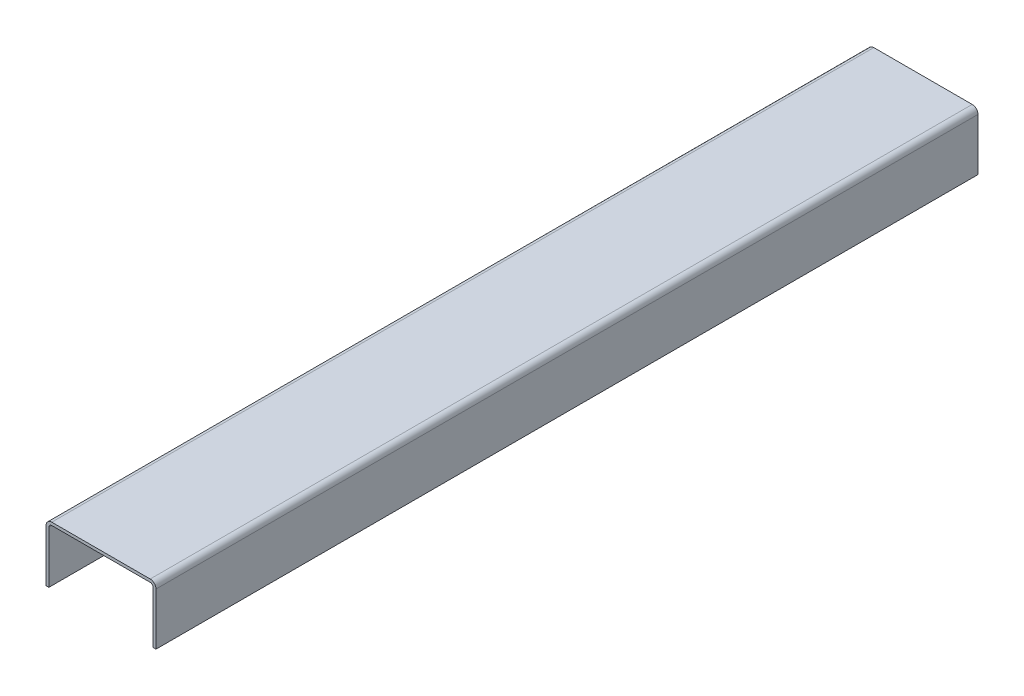
ISO-10303-21;
HEADER;
FILE_DESCRIPTION(('STEP AP214'),'2;1');
FILE_NAME('part.step','',(''),(''),'','','');
FILE_SCHEMA(('AUTOMOTIVE_DESIGN { 1 0 10303 214 1 1 1 1 }'));
ENDSEC;
DATA;
#1=APPLICATION_CONTEXT('core data for automotive mechanical design processes');
#2=APPLICATION_PROTOCOL_DEFINITION('international standard','automotive_design',2000,#1);
#3=PRODUCT_CONTEXT('',#1,'mechanical');
#4=PRODUCT('Part','Part','',(#3));
#5=PRODUCT_RELATED_PRODUCT_CATEGORY('part','',(#4));
#6=PRODUCT_DEFINITION_FORMATION('','',#4);
#7=PRODUCT_DEFINITION_CONTEXT('part definition',#1,'design');
#8=PRODUCT_DEFINITION('design','',#6,#7);
#9=PRODUCT_DEFINITION_SHAPE('','',#8);
#10=(LENGTH_UNIT() NAMED_UNIT(*) SI_UNIT(.MILLI.,.METRE.));
#11=(NAMED_UNIT(*) PLANE_ANGLE_UNIT() SI_UNIT($,.RADIAN.));
#12=(NAMED_UNIT(*) SI_UNIT($,.STERADIAN.) SOLID_ANGLE_UNIT());
#13=UNCERTAINTY_MEASURE_WITH_UNIT(LENGTH_MEASURE(1.E-05),#10,'distance_accuracy_value','');
#14=(GEOMETRIC_REPRESENTATION_CONTEXT(3) GLOBAL_UNCERTAINTY_ASSIGNED_CONTEXT((#13)) GLOBAL_UNIT_ASSIGNED_CONTEXT((#10,
#11,#12)) REPRESENTATION_CONTEXT('',''));
#15=CARTESIAN_POINT('',(0.,0.,0.));
#16=DIRECTION('',(0.,0.,1.));
#17=DIRECTION('',(1.,0.,0.));
#18=AXIS2_PLACEMENT_3D('',#15,#16,#17);
#19=CARTESIAN_POINT('',(0.,0.,284.));
#20=DIRECTION('',(0.,1.,0.));
#21=DIRECTION('',(0.,0.,1.));
#22=AXIS2_PLACEMENT_3D('',#19,#20,#21);
#23=PLANE('',#22);
#24=DIRECTION('',(1.,0.,0.));
#25=VECTOR('',#24,1.);
#26=CARTESIAN_POINT('',(0.,0.,0.));
#27=LINE('',#26,#25);
#28=CARTESIAN_POINT('',(0.,0.,0.));
#29=VERTEX_POINT('',#28);
#30=CARTESIAN_POINT('',(1.,0.,0.));
#31=VERTEX_POINT('',#30);
#32=EDGE_CURVE('E154',#29,#31,#27,.T.);
#33=ORIENTED_EDGE('',*,*,#32,.T.);
#34=DIRECTION('',(0.,0.,-1.));
#35=VECTOR('',#34,1.);
#36=CARTESIAN_POINT('',(1.,0.,284.));
#37=LINE('',#36,#35);
#38=CARTESIAN_POINT('',(1.,0.,284.));
#39=VERTEX_POINT('',#38);
#40=EDGE_CURVE('E11',#39,#31,#37,.T.);
#41=ORIENTED_EDGE('',*,*,#40,.F.);
#42=DIRECTION('',(1.,0.,0.));
#43=VECTOR('',#42,1.);
#44=CARTESIAN_POINT('',(0.,0.,284.));
#45=LINE('',#44,#43);
#46=CARTESIAN_POINT('',(0.,0.,284.));
#47=VERTEX_POINT('',#46);
#48=EDGE_CURVE('E176',#47,#39,#45,.T.);
#49=ORIENTED_EDGE('',*,*,#48,.F.);
#50=DIRECTION('',(0.,0.,-1.));
#51=VECTOR('',#50,1.);
#52=CARTESIAN_POINT('',(0.,0.,284.));
#53=LINE('',#52,#51);
#54=EDGE_CURVE('E150',#47,#29,#53,.T.);
#55=ORIENTED_EDGE('',*,*,#54,.T.);
#56=EDGE_LOOP('',(#33,#41,#49,#55));
#57=FACE_BOUND('',#56,.T.);
#58=ADVANCED_FACE('F34',(#57),#23,.F.);
#59=CARTESIAN_POINT('',(1.,0.,284.));
#60=DIRECTION('',(-1.,0.,0.));
#61=DIRECTION('',(0.,0.,1.));
#62=AXIS2_PLACEMENT_3D('',#59,#60,#61);
#63=PLANE('',#62);
#64=DIRECTION('',(0.,1.,0.));
#65=VECTOR('',#64,1.);
#66=CARTESIAN_POINT('',(1.,0.,0.));
#67=LINE('',#66,#65);
#68=CARTESIAN_POINT('',(1.,18.,0.));
#69=VERTEX_POINT('',#68);
#70=EDGE_CURVE('E157',#31,#69,#67,.T.);
#71=ORIENTED_EDGE('',*,*,#70,.T.);
#72=DIRECTION('',(0.,0.,-1.));
#73=VECTOR('',#72,1.);
#74=CARTESIAN_POINT('',(1.,18.,284.));
#75=LINE('',#74,#73);
#76=CARTESIAN_POINT('',(1.,18.,284.));
#77=VERTEX_POINT('',#76);
#78=EDGE_CURVE('E42',#77,#69,#75,.T.);
#79=ORIENTED_EDGE('',*,*,#78,.F.);
#80=DIRECTION('',(0.,1.,0.));
#81=VECTOR('',#80,1.);
#82=CARTESIAN_POINT('',(1.,0.,284.));
#83=LINE('',#82,#81);
#84=EDGE_CURVE('E105',#39,#77,#83,.T.);
#85=ORIENTED_EDGE('',*,*,#84,.F.);
#86=ORIENTED_EDGE('',*,*,#40,.T.);
#87=EDGE_LOOP('',(#71,#79,#85,#86));
#88=FACE_BOUND('',#87,.T.);
#89=ADVANCED_FACE('F254',(#88),#63,.F.);
#90=CARTESIAN_POINT('',(2.,18.,284.));
#91=DIRECTION('',(0.,0.,-1.));
#92=DIRECTION('',(-1.,0.,0.));
#93=AXIS2_PLACEMENT_3D('',#90,#91,#92);
#94=CYLINDRICAL_SURFACE('',#93,1.);
#95=CARTESIAN_POINT('',(2.,18.,0.));
#96=DIRECTION('',(0.,0.,-1.));
#97=DIRECTION('',(-1.,0.,0.));
#98=AXIS2_PLACEMENT_3D('',#95,#96,#97);
#99=CIRCLE('',#98,1.);
#100=CARTESIAN_POINT('',(2.,19.,0.));
#101=VERTEX_POINT('',#100);
#102=EDGE_CURVE('E159',#69,#101,#99,.T.);
#103=ORIENTED_EDGE('',*,*,#102,.T.);
#104=DIRECTION('',(0.,0.,-1.));
#105=VECTOR('',#104,1.);
#106=CARTESIAN_POINT('',(2.,19.,284.));
#107=LINE('',#106,#105);
#108=CARTESIAN_POINT('',(2.,19.,284.));
#109=VERTEX_POINT('',#108);
#110=EDGE_CURVE('E195',#109,#101,#107,.T.);
#111=ORIENTED_EDGE('',*,*,#110,.F.);
#112=CARTESIAN_POINT('',(2.,18.,284.));
#113=DIRECTION('',(0.,0.,-1.));
#114=DIRECTION('',(-1.,0.,0.));
#115=AXIS2_PLACEMENT_3D('',#112,#113,#114);
#116=CIRCLE('',#115,1.);
#117=EDGE_CURVE('E203',#77,#109,#116,.T.);
#118=ORIENTED_EDGE('',*,*,#117,.F.);
#119=ORIENTED_EDGE('',*,*,#78,.T.);
#120=EDGE_LOOP('',(#103,#111,#118,#119));
#121=FACE_BOUND('',#120,.T.);
#122=ADVANCED_FACE('F201',(#121),#94,.F.);
#123=CARTESIAN_POINT('',(2.,19.,284.));
#124=DIRECTION('',(0.,1.,0.));
#125=DIRECTION('',(-1.,0.,0.));
#126=AXIS2_PLACEMENT_3D('',#123,#124,#125);
#127=PLANE('',#126);
#128=DIRECTION('',(1.,0.,0.));
#129=VECTOR('',#128,1.);
#130=CARTESIAN_POINT('',(2.,19.,0.));
#131=LINE('',#130,#129);
#132=CARTESIAN_POINT('',(36.,19.,0.));
#133=VERTEX_POINT('',#132);
#134=EDGE_CURVE('E161',#101,#133,#131,.T.);
#135=ORIENTED_EDGE('',*,*,#134,.T.);
#136=DIRECTION('',(0.,0.,-1.));
#137=VECTOR('',#136,1.);
#138=CARTESIAN_POINT('',(36.,19.,284.));
#139=LINE('',#138,#137);
#140=CARTESIAN_POINT('',(36.,19.,284.));
#141=VERTEX_POINT('',#140);
#142=EDGE_CURVE('E192',#141,#133,#139,.T.);
#143=ORIENTED_EDGE('',*,*,#142,.F.);
#144=DIRECTION('',(1.,0.,0.));
#145=VECTOR('',#144,1.);
#146=CARTESIAN_POINT('',(2.,19.,284.));
#147=LINE('',#146,#145);
#148=EDGE_CURVE('E221',#109,#141,#147,.T.);
#149=ORIENTED_EDGE('',*,*,#148,.F.);
#150=ORIENTED_EDGE('',*,*,#110,.T.);
#151=EDGE_LOOP('',(#135,#143,#149,#150));
#152=FACE_BOUND('',#151,.T.);
#153=ADVANCED_FACE('F212',(#152),#127,.F.);
#154=CARTESIAN_POINT('',(36.,18.,284.));
#155=DIRECTION('',(0.,0.,-1.));
#156=DIRECTION('',(-1.,0.,0.));
#157=AXIS2_PLACEMENT_3D('',#154,#155,#156);
#158=CYLINDRICAL_SURFACE('',#157,0.999999999999999);
#159=CARTESIAN_POINT('',(36.,18.,0.));
#160=DIRECTION('',(0.,0.,-1.));
#161=DIRECTION('',(-1.,0.,0.));
#162=AXIS2_PLACEMENT_3D('',#159,#160,#161);
#163=CIRCLE('',#162,0.999999999999999);
#164=CARTESIAN_POINT('',(37.,18.,0.));
#165=VERTEX_POINT('',#164);
#166=EDGE_CURVE('E163',#133,#165,#163,.T.);
#167=ORIENTED_EDGE('',*,*,#166,.T.);
#168=DIRECTION('',(0.,0.,-1.));
#169=VECTOR('',#168,1.);
#170=CARTESIAN_POINT('',(37.,18.,284.));
#171=LINE('',#170,#169);
#172=CARTESIAN_POINT('',(37.,18.,284.));
#173=VERTEX_POINT('',#172);
#174=EDGE_CURVE('E189',#173,#165,#171,.T.);
#175=ORIENTED_EDGE('',*,*,#174,.F.);
#176=CARTESIAN_POINT('',(36.,18.,284.));
#177=DIRECTION('',(0.,0.,-1.));
#178=DIRECTION('',(-1.,0.,0.));
#179=AXIS2_PLACEMENT_3D('',#176,#177,#178);
#180=CIRCLE('',#179,0.999999999999999);
#181=EDGE_CURVE('E218',#141,#173,#180,.T.);
#182=ORIENTED_EDGE('',*,*,#181,.F.);
#183=ORIENTED_EDGE('',*,*,#142,.T.);
#184=EDGE_LOOP('',(#167,#175,#182,#183));
#185=FACE_BOUND('',#184,.T.);
#186=ADVANCED_FACE('F216',(#185),#158,.F.);
#187=CARTESIAN_POINT('',(37.,18.,284.));
#188=DIRECTION('',(1.,0.,0.));
#189=DIRECTION('',(0.,0.,-1.));
#190=AXIS2_PLACEMENT_3D('',#187,#188,#189);
#191=PLANE('',#190);
#192=DIRECTION('',(0.,-1.,0.));
#193=VECTOR('',#192,1.);
#194=CARTESIAN_POINT('',(37.,18.,0.));
#195=LINE('',#194,#193);
#196=CARTESIAN_POINT('',(37.,0.,0.));
#197=VERTEX_POINT('',#196);
#198=EDGE_CURVE('E165',#165,#197,#195,.T.);
#199=ORIENTED_EDGE('',*,*,#198,.T.);
#200=DIRECTION('',(0.,0.,-1.));
#201=VECTOR('',#200,1.);
#202=CARTESIAN_POINT('',(37.,0.,284.));
#203=LINE('',#202,#201);
#204=CARTESIAN_POINT('',(37.,0.,284.));
#205=VERTEX_POINT('',#204);
#206=EDGE_CURVE('E186',#205,#197,#203,.T.);
#207=ORIENTED_EDGE('',*,*,#206,.F.);
#208=DIRECTION('',(0.,-1.,0.));
#209=VECTOR('',#208,1.);
#210=CARTESIAN_POINT('',(37.,18.,284.));
#211=LINE('',#210,#209);
#212=EDGE_CURVE('E220',#173,#205,#211,.T.);
#213=ORIENTED_EDGE('',*,*,#212,.F.);
#214=ORIENTED_EDGE('',*,*,#174,.T.);
#215=EDGE_LOOP('',(#199,#207,#213,#214));
#216=FACE_BOUND('',#215,.T.);
#217=ADVANCED_FACE('F267',(#216),#191,.F.);
#218=CARTESIAN_POINT('',(37.,0.,284.));
#219=DIRECTION('',(0.,1.,0.));
#220=DIRECTION('',(0.,0.,1.));
#221=AXIS2_PLACEMENT_3D('',#218,#219,#220);
#222=PLANE('',#221);
#223=DIRECTION('',(1.,0.,0.));
#224=VECTOR('',#223,1.);
#225=CARTESIAN_POINT('',(37.,0.,0.));
#226=LINE('',#225,#224);
#227=CARTESIAN_POINT('',(38.,0.,0.));
#228=VERTEX_POINT('',#227);
#229=EDGE_CURVE('E167',#197,#228,#226,.T.);
#230=ORIENTED_EDGE('',*,*,#229,.T.);
#231=DIRECTION('',(0.,0.,-1.));
#232=VECTOR('',#231,1.);
#233=CARTESIAN_POINT('',(38.,0.,284.));
#234=LINE('',#233,#232);
#235=CARTESIAN_POINT('',(38.,0.,284.));
#236=VERTEX_POINT('',#235);
#237=EDGE_CURVE('E183',#236,#228,#234,.T.);
#238=ORIENTED_EDGE('',*,*,#237,.F.);
#239=DIRECTION('',(1.,0.,0.));
#240=VECTOR('',#239,1.);
#241=CARTESIAN_POINT('',(37.,0.,284.));
#242=LINE('',#241,#240);
#243=EDGE_CURVE('E223',#205,#236,#242,.T.);
#244=ORIENTED_EDGE('',*,*,#243,.F.);
#245=ORIENTED_EDGE('',*,*,#206,.T.);
#246=EDGE_LOOP('',(#230,#238,#244,#245));
#247=FACE_BOUND('',#246,.T.);
#248=ADVANCED_FACE('F270',(#247),#222,.F.);
#249=CARTESIAN_POINT('',(38.,18.,284.));
#250=DIRECTION('',(-1.,0.,0.));
#251=DIRECTION('',(0.,-1.,0.));
#252=AXIS2_PLACEMENT_3D('',#249,#250,#251);
#253=PLANE('',#252);
#254=DIRECTION('',(0.,1.,0.));
#255=VECTOR('',#254,1.);
#256=CARTESIAN_POINT('',(38.,18.,0.));
#257=LINE('',#256,#255);
#258=CARTESIAN_POINT('',(38.,18.,0.));
#259=VERTEX_POINT('',#258);
#260=EDGE_CURVE('E169',#228,#259,#257,.T.);
#261=ORIENTED_EDGE('',*,*,#260,.T.);
#262=DIRECTION('',(0.,0.,-1.));
#263=VECTOR('',#262,1.);
#264=CARTESIAN_POINT('',(38.,18.,284.));
#265=LINE('',#264,#263);
#266=CARTESIAN_POINT('',(38.,18.,284.));
#267=VERTEX_POINT('',#266);
#268=EDGE_CURVE('E180',#267,#259,#265,.T.);
#269=ORIENTED_EDGE('',*,*,#268,.F.);
#270=DIRECTION('',(0.,1.,0.));
#271=VECTOR('',#270,1.);
#272=CARTESIAN_POINT('',(38.,18.,284.));
#273=LINE('',#272,#271);
#274=EDGE_CURVE('E229',#236,#267,#273,.T.);
#275=ORIENTED_EDGE('',*,*,#274,.F.);
#276=ORIENTED_EDGE('',*,*,#237,.T.);
#277=EDGE_LOOP('',(#261,#269,#275,#276));
#278=FACE_BOUND('',#277,.T.);
#279=ADVANCED_FACE('F235',(#278),#253,.F.);
#280=CARTESIAN_POINT('',(36.,18.,284.));
#281=DIRECTION('',(0.,0.,-1.));
#282=DIRECTION('',(-1.,0.,0.));
#283=AXIS2_PLACEMENT_3D('',#280,#281,#282);
#284=CYLINDRICAL_SURFACE('',#283,2.);
#285=CARTESIAN_POINT('',(36.,18.,0.));
#286=DIRECTION('',(0.,0.,1.));
#287=DIRECTION('',(-1.,0.,0.));
#288=AXIS2_PLACEMENT_3D('',#285,#286,#287);
#289=CIRCLE('',#288,2.);
#290=CARTESIAN_POINT('',(36.,20.,0.));
#291=VERTEX_POINT('',#290);
#292=EDGE_CURVE('E171',#259,#291,#289,.T.);
#293=ORIENTED_EDGE('',*,*,#292,.T.);
#294=DIRECTION('',(0.,0.,-1.));
#295=VECTOR('',#294,1.);
#296=CARTESIAN_POINT('',(36.,20.,284.));
#297=LINE('',#296,#295);
#298=CARTESIAN_POINT('',(36.,20.,284.));
#299=VERTEX_POINT('',#298);
#300=EDGE_CURVE('E145',#299,#291,#297,.T.);
#301=ORIENTED_EDGE('',*,*,#300,.F.);
#302=CARTESIAN_POINT('',(36.,18.,284.));
#303=DIRECTION('',(0.,0.,1.));
#304=DIRECTION('',(-1.,0.,0.));
#305=AXIS2_PLACEMENT_3D('',#302,#303,#304);
#306=CIRCLE('',#305,2.);
#307=EDGE_CURVE('E136',#267,#299,#306,.T.);
#308=ORIENTED_EDGE('',*,*,#307,.F.);
#309=ORIENTED_EDGE('',*,*,#268,.T.);
#310=EDGE_LOOP('',(#293,#301,#308,#309));
#311=FACE_BOUND('',#310,.T.);
#312=ADVANCED_FACE('F239',(#311),#284,.T.);
#313=CARTESIAN_POINT('',(2.,20.,284.));
#314=DIRECTION('',(0.,-1.,0.));
#315=DIRECTION('',(0.,0.,-1.));
#316=AXIS2_PLACEMENT_3D('',#313,#314,#315);
#317=PLANE('',#316);
#318=DIRECTION('',(-1.,0.,0.));
#319=VECTOR('',#318,1.);
#320=CARTESIAN_POINT('',(2.,20.,0.));
#321=LINE('',#320,#319);
#322=CARTESIAN_POINT('',(2.,20.,0.));
#323=VERTEX_POINT('',#322);
#324=EDGE_CURVE('E144',#291,#323,#321,.T.);
#325=ORIENTED_EDGE('',*,*,#324,.T.);
#326=DIRECTION('',(0.,0.,-1.));
#327=VECTOR('',#326,1.);
#328=CARTESIAN_POINT('',(2.,20.,284.));
#329=LINE('',#328,#327);
#330=CARTESIAN_POINT('',(2.,20.,284.));
#331=VERTEX_POINT('',#330);
#332=EDGE_CURVE('E141',#331,#323,#329,.T.);
#333=ORIENTED_EDGE('',*,*,#332,.F.);
#334=DIRECTION('',(-1.,0.,0.));
#335=VECTOR('',#334,1.);
#336=CARTESIAN_POINT('',(2.,20.,284.));
#337=LINE('',#336,#335);
#338=EDGE_CURVE('E130',#299,#331,#337,.T.);
#339=ORIENTED_EDGE('',*,*,#338,.F.);
#340=ORIENTED_EDGE('',*,*,#300,.T.);
#341=EDGE_LOOP('',(#325,#333,#339,#340));
#342=FACE_BOUND('',#341,.T.);
#343=ADVANCED_FACE('F142',(#342),#317,.F.);
#344=CARTESIAN_POINT('',(2.,18.,284.));
#345=DIRECTION('',(0.,0.,-1.));
#346=DIRECTION('',(-1.,0.,0.));
#347=AXIS2_PLACEMENT_3D('',#344,#345,#346);
#348=CYLINDRICAL_SURFACE('',#347,2.);
#349=CARTESIAN_POINT('',(2.,18.,0.));
#350=DIRECTION('',(0.,0.,1.));
#351=DIRECTION('',(-1.,0.,0.));
#352=AXIS2_PLACEMENT_3D('',#349,#350,#351);
#353=CIRCLE('',#352,2.);
#354=CARTESIAN_POINT('',(0.,18.,0.));
#355=VERTEX_POINT('',#354);
#356=EDGE_CURVE('E91',#323,#355,#353,.T.);
#357=ORIENTED_EDGE('',*,*,#356,.T.);
#358=DIRECTION('',(0.,0.,-1.));
#359=VECTOR('',#358,1.);
#360=CARTESIAN_POINT('',(0.,18.,284.));
#361=LINE('',#360,#359);
#362=CARTESIAN_POINT('',(0.,18.,284.));
#363=VERTEX_POINT('',#362);
#364=EDGE_CURVE('E146',#363,#355,#361,.T.);
#365=ORIENTED_EDGE('',*,*,#364,.F.);
#366=CARTESIAN_POINT('',(2.,18.,284.));
#367=DIRECTION('',(0.,0.,1.));
#368=DIRECTION('',(-1.,0.,0.));
#369=AXIS2_PLACEMENT_3D('',#366,#367,#368);
#370=CIRCLE('',#369,2.);
#371=EDGE_CURVE('E134',#331,#363,#370,.T.);
#372=ORIENTED_EDGE('',*,*,#371,.F.);
#373=ORIENTED_EDGE('',*,*,#332,.T.);
#374=EDGE_LOOP('',(#357,#365,#372,#373));
#375=FACE_BOUND('',#374,.T.);
#376=ADVANCED_FACE('F148',(#375),#348,.T.);
#377=CARTESIAN_POINT('',(0.,0.,284.));
#378=DIRECTION('',(1.,0.,0.));
#379=DIRECTION('',(0.,1.,0.));
#380=AXIS2_PLACEMENT_3D('',#377,#378,#379);
#381=PLANE('',#380);
#382=DIRECTION('',(0.,-1.,0.));
#383=VECTOR('',#382,1.);
#384=CARTESIAN_POINT('',(0.,0.,0.));
#385=LINE('',#384,#383);
#386=EDGE_CURVE('E97',#355,#29,#385,.T.);
#387=ORIENTED_EDGE('',*,*,#386,.T.);
#388=ORIENTED_EDGE('',*,*,#54,.F.);
#389=DIRECTION('',(0.,-1.,0.));
#390=VECTOR('',#389,1.);
#391=CARTESIAN_POINT('',(0.,0.,284.));
#392=LINE('',#391,#390);
#393=EDGE_CURVE('E50',#363,#47,#392,.T.);
#394=ORIENTED_EDGE('',*,*,#393,.F.);
#395=ORIENTED_EDGE('',*,*,#364,.T.);
#396=EDGE_LOOP('',(#387,#388,#394,#395));
#397=FACE_BOUND('',#396,.T.);
#398=ADVANCED_FACE('F243',(#397),#381,.F.);
#399=CARTESIAN_POINT('',(2.,18.,284.));
#400=DIRECTION('',(0.,0.,-1.));
#401=DIRECTION('',(-1.,0.,0.));
#402=AXIS2_PLACEMENT_3D('',#399,#400,#401);
#403=PLANE('',#402);
#404=ORIENTED_EDGE('',*,*,#48,.T.);
#405=ORIENTED_EDGE('',*,*,#84,.T.);
#406=ORIENTED_EDGE('',*,*,#117,.T.);
#407=ORIENTED_EDGE('',*,*,#148,.T.);
#408=ORIENTED_EDGE('',*,*,#181,.T.);
#409=ORIENTED_EDGE('',*,*,#212,.T.);
#410=ORIENTED_EDGE('',*,*,#243,.T.);
#411=ORIENTED_EDGE('',*,*,#274,.T.);
#412=ORIENTED_EDGE('',*,*,#307,.T.);
#413=ORIENTED_EDGE('',*,*,#338,.T.);
#414=ORIENTED_EDGE('',*,*,#371,.T.);
#415=ORIENTED_EDGE('',*,*,#393,.T.);
#416=EDGE_LOOP('',(#404,#405,#406,#407,#408,#409,#410,#411,#412,#413,#414,#415));
#417=FACE_BOUND('',#416,.T.);
#418=ADVANCED_FACE('F132',(#417),#403,.F.);
#419=CARTESIAN_POINT('',(2.,18.,0.));
#420=DIRECTION('',(0.,0.,-1.));
#421=DIRECTION('',(-1.,0.,0.));
#422=AXIS2_PLACEMENT_3D('',#419,#420,#421);
#423=PLANE('',#422);
#424=ORIENTED_EDGE('',*,*,#32,.F.);
#425=ORIENTED_EDGE('',*,*,#386,.F.);
#426=ORIENTED_EDGE('',*,*,#356,.F.);
#427=ORIENTED_EDGE('',*,*,#324,.F.);
#428=ORIENTED_EDGE('',*,*,#292,.F.);
#429=ORIENTED_EDGE('',*,*,#260,.F.);
#430=ORIENTED_EDGE('',*,*,#229,.F.);
#431=ORIENTED_EDGE('',*,*,#198,.F.);
#432=ORIENTED_EDGE('',*,*,#166,.F.);
#433=ORIENTED_EDGE('',*,*,#134,.F.);
#434=ORIENTED_EDGE('',*,*,#102,.F.);
#435=ORIENTED_EDGE('',*,*,#70,.F.);
#436=EDGE_LOOP('',(#424,#425,#426,#427,#428,#429,#430,#431,#432,#433,#434,#435));
#437=FACE_BOUND('',#436,.T.);
#438=ADVANCED_FACE('F207',(#437),#423,.T.);
#439=CLOSED_SHELL('',(#58,#89,#122,#153,#186,#217,#248,#279,#312,#343,#376,#398,#418,#438));
#440=MANIFOLD_SOLID_BREP('B2',#439);
#441=ADVANCED_BREP_SHAPE_REPRESENTATION('',(#18,#440),#14);
#442=SHAPE_DEFINITION_REPRESENTATION(#9,#441);
ENDSEC;
END-ISO-10303-21;
